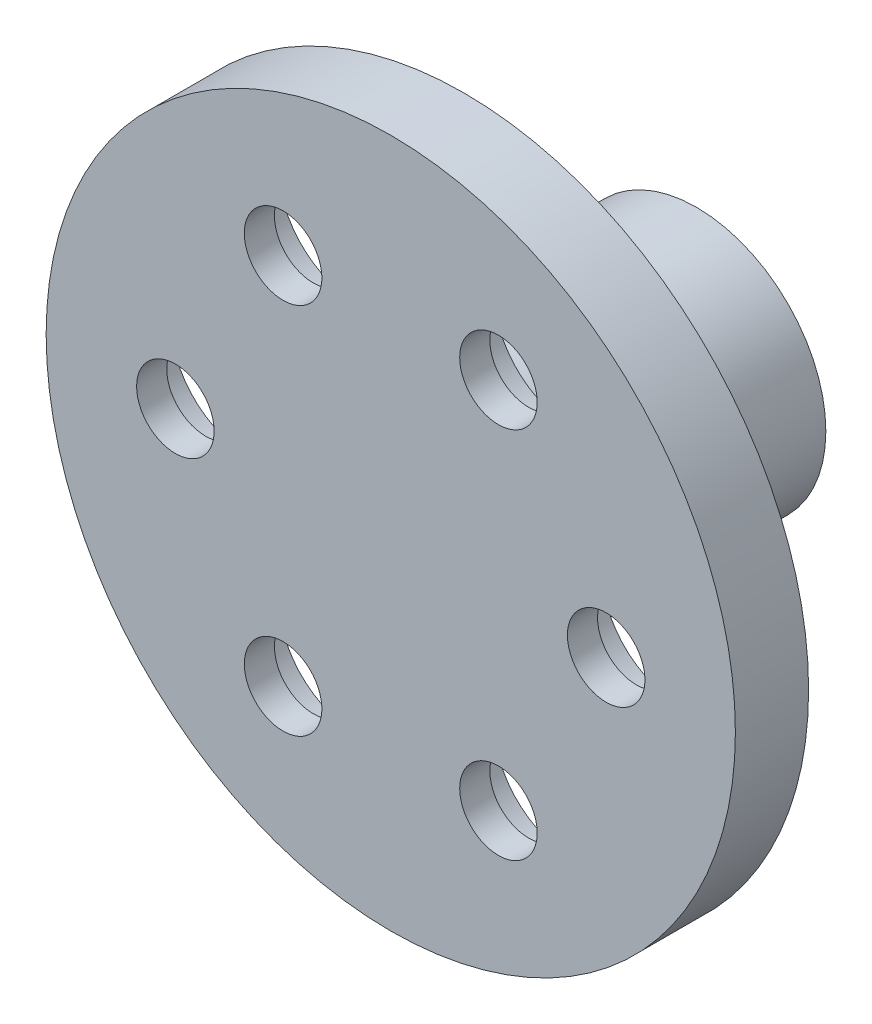
ISO-10303-21;
HEADER;
FILE_DESCRIPTION(('STEP AP214'),'2;1');
FILE_NAME('part.step','',(''),(''),'','','');
FILE_SCHEMA(('AUTOMOTIVE_DESIGN { 1 0 10303 214 1 1 1 1 }'));
ENDSEC;
DATA;
#1=APPLICATION_CONTEXT('core data for automotive mechanical design processes');
#2=APPLICATION_PROTOCOL_DEFINITION('international standard','automotive_design',2000,#1);
#3=PRODUCT_CONTEXT('',#1,'mechanical');
#4=PRODUCT('Part','Part','',(#3));
#5=PRODUCT_RELATED_PRODUCT_CATEGORY('part','',(#4));
#6=PRODUCT_DEFINITION_FORMATION('','',#4);
#7=PRODUCT_DEFINITION_CONTEXT('part definition',#1,'design');
#8=PRODUCT_DEFINITION('design','',#6,#7);
#9=PRODUCT_DEFINITION_SHAPE('','',#8);
#10=(LENGTH_UNIT() NAMED_UNIT(*) SI_UNIT(.MILLI.,.METRE.));
#11=(NAMED_UNIT(*) PLANE_ANGLE_UNIT() SI_UNIT($,.RADIAN.));
#12=(NAMED_UNIT(*) SI_UNIT($,.STERADIAN.) SOLID_ANGLE_UNIT());
#13=UNCERTAINTY_MEASURE_WITH_UNIT(LENGTH_MEASURE(1.E-05),#10,'distance_accuracy_value','');
#14=(GEOMETRIC_REPRESENTATION_CONTEXT(3) GLOBAL_UNCERTAINTY_ASSIGNED_CONTEXT((#13)) GLOBAL_UNIT_ASSIGNED_CONTEXT((#10,
#11,#12)) REPRESENTATION_CONTEXT('',''));
#15=CARTESIAN_POINT('',(0.,0.,0.));
#16=DIRECTION('',(0.,0.,1.));
#17=DIRECTION('',(1.,0.,0.));
#18=AXIS2_PLACEMENT_3D('',#15,#16,#17);
#19=CARTESIAN_POINT('',(0.,0.,0.));
#20=DIRECTION('',(0.,0.,1.));
#21=DIRECTION('',(1.,0.,0.));
#22=AXIS2_PLACEMENT_3D('',#19,#20,#21);
#23=PLANE('',#22);
#24=CARTESIAN_POINT('',(12.5,21.650635094611,0.));
#25=DIRECTION('',(0.,0.,-1.));
#26=DIRECTION('',(-1.,0.,0.));
#27=AXIS2_PLACEMENT_3D('',#24,#25,#26);
#28=CIRCLE('',#27,9.);
#29=CARTESIAN_POINT('',(3.49999999999999,21.650635094611,0.));
#30=VERTEX_POINT('',#29);
#31=EDGE_CURVE('E92',#30,#30,#28,.T.);
#32=ORIENTED_EDGE('',*,*,#31,.F.);
#33=EDGE_LOOP('',(#32));
#34=FACE_BOUND('',#33,.T.);
#35=CARTESIAN_POINT('',(-25.,0.,0.));
#36=DIRECTION('',(0.,0.,-1.));
#37=DIRECTION('',(-1.,0.,0.));
#38=AXIS2_PLACEMENT_3D('',#35,#36,#37);
#39=CIRCLE('',#38,9.);
#40=CARTESIAN_POINT('',(-34.,0.,0.));
#41=VERTEX_POINT('',#40);
#42=EDGE_CURVE('E104',#41,#41,#39,.T.);
#43=ORIENTED_EDGE('',*,*,#42,.F.);
#44=EDGE_LOOP('',(#43));
#45=FACE_BOUND('',#44,.T.);
#46=CARTESIAN_POINT('',(25.,0.,0.));
#47=DIRECTION('',(0.,0.,-1.));
#48=DIRECTION('',(-1.,0.,0.));
#49=AXIS2_PLACEMENT_3D('',#46,#47,#48);
#50=CIRCLE('',#49,9.);
#51=CARTESIAN_POINT('',(16.,0.,0.));
#52=VERTEX_POINT('',#51);
#53=EDGE_CURVE('E110',#52,#52,#50,.T.);
#54=ORIENTED_EDGE('',*,*,#53,.F.);
#55=EDGE_LOOP('',(#54));
#56=FACE_BOUND('',#55,.T.);
#57=CARTESIAN_POINT('',(12.5,-21.650635094611,0.));
#58=DIRECTION('',(0.,0.,-1.));
#59=DIRECTION('',(-1.,0.,0.));
#60=AXIS2_PLACEMENT_3D('',#57,#58,#59);
#61=CIRCLE('',#60,9.);
#62=CARTESIAN_POINT('',(3.50000000000001,-21.650635094611,0.));
#63=VERTEX_POINT('',#62);
#64=EDGE_CURVE('E116',#63,#63,#61,.T.);
#65=ORIENTED_EDGE('',*,*,#64,.F.);
#66=EDGE_LOOP('',(#65));
#67=FACE_BOUND('',#66,.T.);
#68=CARTESIAN_POINT('',(-12.5,-21.650635094611,0.));
#69=DIRECTION('',(0.,0.,-1.));
#70=DIRECTION('',(-1.,0.,0.));
#71=AXIS2_PLACEMENT_3D('',#68,#69,#70);
#72=CIRCLE('',#71,9.);
#73=CARTESIAN_POINT('',(-21.5,-21.650635094611,0.));
#74=VERTEX_POINT('',#73);
#75=EDGE_CURVE('E122',#74,#74,#72,.T.);
#76=ORIENTED_EDGE('',*,*,#75,.F.);
#77=EDGE_LOOP('',(#76));
#78=FACE_BOUND('',#77,.T.);
#79=CARTESIAN_POINT('',(0.,0.,0.));
#80=DIRECTION('',(0.,0.,-1.));
#81=DIRECTION('',(-1.,0.,0.));
#82=AXIS2_PLACEMENT_3D('',#79,#80,#81);
#83=CIRCLE('',#82,15.);
#84=CARTESIAN_POINT('',(-15.,0.,0.));
#85=VERTEX_POINT('',#84);
#86=EDGE_CURVE('E11',#85,#85,#83,.T.);
#87=ORIENTED_EDGE('',*,*,#86,.F.);
#88=EDGE_LOOP('',(#87));
#89=FACE_BOUND('',#88,.T.);
#90=CARTESIAN_POINT('',(0.,0.,0.));
#91=DIRECTION('',(0.,0.,1.));
#92=DIRECTION('',(1.,0.,0.));
#93=AXIS2_PLACEMENT_3D('',#90,#91,#92);
#94=CIRCLE('',#93,40.);
#95=CARTESIAN_POINT('',(40.,0.,0.));
#96=VERTEX_POINT('',#95);
#97=EDGE_CURVE('E127',#96,#96,#94,.T.);
#98=ORIENTED_EDGE('',*,*,#97,.F.);
#99=EDGE_LOOP('',(#98));
#100=FACE_BOUND('',#99,.T.);
#101=CARTESIAN_POINT('',(-12.5,21.650635094611,0.));
#102=DIRECTION('',(0.,0.,-1.));
#103=DIRECTION('',(-1.,0.,0.));
#104=AXIS2_PLACEMENT_3D('',#101,#102,#103);
#105=CIRCLE('',#104,9.);
#106=CARTESIAN_POINT('',(-21.5,21.650635094611,0.));
#107=VERTEX_POINT('',#106);
#108=EDGE_CURVE('E98',#107,#107,#105,.T.);
#109=ORIENTED_EDGE('',*,*,#108,.F.);
#110=EDGE_LOOP('',(#109));
#111=FACE_BOUND('',#110,.T.);
#112=ADVANCED_FACE('F34',(#34,#45,#56,#67,#78,#89,#100,#111),#23,.F.);
#113=CARTESIAN_POINT('',(0.,0.,8.5));
#114=DIRECTION('',(0.,0.,-1.));
#115=DIRECTION('',(-1.,0.,0.));
#116=AXIS2_PLACEMENT_3D('',#113,#114,#115);
#117=CYLINDRICAL_SURFACE('',#116,40.);
#118=CARTESIAN_POINT('',(0.,0.,8.5));
#119=DIRECTION('',(0.,0.,1.));
#120=DIRECTION('',(1.,0.,0.));
#121=AXIS2_PLACEMENT_3D('',#118,#119,#120);
#122=CIRCLE('',#121,40.);
#123=CARTESIAN_POINT('',(40.,0.,8.5));
#124=VERTEX_POINT('',#123);
#125=EDGE_CURVE('E42',#124,#124,#122,.T.);
#126=ORIENTED_EDGE('',*,*,#125,.F.);
#127=EDGE_LOOP('',(#126));
#128=FACE_BOUND('',#127,.T.);
#129=ORIENTED_EDGE('',*,*,#97,.T.);
#130=EDGE_LOOP('',(#129));
#131=FACE_BOUND('',#130,.T.);
#132=ADVANCED_FACE('F36',(#128,#131),#117,.T.);
#133=CARTESIAN_POINT('',(0.,0.,8.5));
#134=DIRECTION('',(0.,0.,1.));
#135=DIRECTION('',(1.,0.,0.));
#136=AXIS2_PLACEMENT_3D('',#133,#134,#135);
#137=PLANE('',#136);
#138=CARTESIAN_POINT('',(-12.5,21.650635094611,8.5));
#139=DIRECTION('',(0.,0.,-1.));
#140=DIRECTION('',(-1.,0.,0.));
#141=AXIS2_PLACEMENT_3D('',#138,#139,#140);
#142=CIRCLE('',#141,4.5);
#143=CARTESIAN_POINT('',(-17.,21.650635094611,8.5));
#144=VERTEX_POINT('',#143);
#145=EDGE_CURVE('E58',#144,#144,#142,.T.);
#146=ORIENTED_EDGE('',*,*,#145,.T.);
#147=EDGE_LOOP('',(#146));
#148=FACE_BOUND('',#147,.T.);
#149=CARTESIAN_POINT('',(-25.,0.,8.5));
#150=DIRECTION('',(0.,0.,-1.));
#151=DIRECTION('',(-1.,0.,0.));
#152=AXIS2_PLACEMENT_3D('',#149,#150,#151);
#153=CIRCLE('',#152,4.5);
#154=CARTESIAN_POINT('',(-29.5,0.,8.5));
#155=VERTEX_POINT('',#154);
#156=EDGE_CURVE('E66',#155,#155,#153,.T.);
#157=ORIENTED_EDGE('',*,*,#156,.T.);
#158=EDGE_LOOP('',(#157));
#159=FACE_BOUND('',#158,.T.);
#160=CARTESIAN_POINT('',(-12.5,-21.650635094611,8.5));
#161=DIRECTION('',(0.,0.,-1.));
#162=DIRECTION('',(-1.,0.,0.));
#163=AXIS2_PLACEMENT_3D('',#160,#161,#162);
#164=CIRCLE('',#163,4.5);
#165=CARTESIAN_POINT('',(-17.,-21.650635094611,8.5));
#166=VERTEX_POINT('',#165);
#167=EDGE_CURVE('E72',#166,#166,#164,.T.);
#168=ORIENTED_EDGE('',*,*,#167,.T.);
#169=EDGE_LOOP('',(#168));
#170=FACE_BOUND('',#169,.T.);
#171=CARTESIAN_POINT('',(12.5,-21.650635094611,8.5));
#172=DIRECTION('',(0.,0.,-1.));
#173=DIRECTION('',(-1.,0.,0.));
#174=AXIS2_PLACEMENT_3D('',#171,#172,#173);
#175=CIRCLE('',#174,4.5);
#176=CARTESIAN_POINT('',(8.00000000000001,-21.650635094611,8.5));
#177=VERTEX_POINT('',#176);
#178=EDGE_CURVE('E78',#177,#177,#175,.T.);
#179=ORIENTED_EDGE('',*,*,#178,.T.);
#180=EDGE_LOOP('',(#179));
#181=FACE_BOUND('',#180,.T.);
#182=CARTESIAN_POINT('',(25.,0.,8.5));
#183=DIRECTION('',(0.,0.,-1.));
#184=DIRECTION('',(-1.,0.,0.));
#185=AXIS2_PLACEMENT_3D('',#182,#183,#184);
#186=CIRCLE('',#185,4.5);
#187=CARTESIAN_POINT('',(20.5,0.,8.5));
#188=VERTEX_POINT('',#187);
#189=EDGE_CURVE('E81',#188,#188,#186,.T.);
#190=ORIENTED_EDGE('',*,*,#189,.T.);
#191=EDGE_LOOP('',(#190));
#192=FACE_BOUND('',#191,.T.);
#193=CARTESIAN_POINT('',(12.5,21.650635094611,8.5));
#194=DIRECTION('',(0.,0.,-1.));
#195=DIRECTION('',(-1.,0.,0.));
#196=AXIS2_PLACEMENT_3D('',#193,#194,#195);
#197=CIRCLE('',#196,4.5);
#198=CARTESIAN_POINT('',(7.99999999999999,21.650635094611,8.5));
#199=VERTEX_POINT('',#198);
#200=EDGE_CURVE('E85',#199,#199,#197,.T.);
#201=ORIENTED_EDGE('',*,*,#200,.T.);
#202=EDGE_LOOP('',(#201));
#203=FACE_BOUND('',#202,.T.);
#204=ORIENTED_EDGE('',*,*,#125,.T.);
#205=EDGE_LOOP('',(#204));
#206=FACE_BOUND('',#205,.T.);
#207=ADVANCED_FACE('F162',(#148,#159,#170,#181,#192,#203,#206),#137,.T.);
#208=CARTESIAN_POINT('',(0.,0.,-27.));
#209=DIRECTION('',(0.,0.,1.));
#210=DIRECTION('',(1.,0.,0.));
#211=AXIS2_PLACEMENT_3D('',#208,#209,#210);
#212=CYLINDRICAL_SURFACE('',#211,15.);
#213=CARTESIAN_POINT('',(0.,0.,-27.));
#214=DIRECTION('',(0.,0.,-1.));
#215=DIRECTION('',(-1.,0.,0.));
#216=AXIS2_PLACEMENT_3D('',#213,#214,#215);
#217=CIRCLE('',#216,15.);
#218=CARTESIAN_POINT('',(-15.,0.,-27.));
#219=VERTEX_POINT('',#218);
#220=EDGE_CURVE('E125',#219,#219,#217,.T.);
#221=ORIENTED_EDGE('',*,*,#220,.F.);
#222=EDGE_LOOP('',(#221));
#223=FACE_BOUND('',#222,.T.);
#224=ORIENTED_EDGE('',*,*,#86,.T.);
#225=EDGE_LOOP('',(#224));
#226=FACE_BOUND('',#225,.T.);
#227=ADVANCED_FACE('F169',(#223,#226),#212,.T.);
#228=CARTESIAN_POINT('',(0.,0.,-27.));
#229=DIRECTION('',(0.,0.,-1.));
#230=DIRECTION('',(-1.,0.,0.));
#231=AXIS2_PLACEMENT_3D('',#228,#229,#230);
#232=PLANE('',#231);
#233=CARTESIAN_POINT('',(0.,0.,-27.));
#234=DIRECTION('',(0.,0.,-1.));
#235=DIRECTION('',(-1.,0.,0.));
#236=AXIS2_PLACEMENT_3D('',#233,#234,#235);
#237=CIRCLE('',#236,3.8);
#238=CARTESIAN_POINT('',(-3.8,0.,-27.));
#239=VERTEX_POINT('',#238);
#240=EDGE_CURVE('E55',#239,#239,#237,.T.);
#241=ORIENTED_EDGE('',*,*,#240,.F.);
#242=EDGE_LOOP('',(#241));
#243=FACE_BOUND('',#242,.T.);
#244=ORIENTED_EDGE('',*,*,#220,.T.);
#245=EDGE_LOOP('',(#244));
#246=FACE_BOUND('',#245,.T.);
#247=ADVANCED_FACE('F173',(#243,#246),#232,.T.);
#248=CARTESIAN_POINT('',(-12.5,-21.650635094611,0.));
#249=DIRECTION('',(0.,0.,-1.));
#250=DIRECTION('',(-1.,0.,0.));
#251=AXIS2_PLACEMENT_3D('',#248,#249,#250);
#252=CYLINDRICAL_SURFACE('',#251,9.);
#253=CARTESIAN_POINT('',(-12.5,-21.650635094611,5.));
#254=DIRECTION('',(0.,0.,-1.));
#255=DIRECTION('',(-1.,0.,0.));
#256=AXIS2_PLACEMENT_3D('',#253,#254,#255);
#257=CIRCLE('',#256,9.);
#258=CARTESIAN_POINT('',(-21.5,-21.650635094611,5.));
#259=VERTEX_POINT('',#258);
#260=EDGE_CURVE('E119',#259,#259,#257,.T.);
#261=ORIENTED_EDGE('',*,*,#260,.F.);
#262=EDGE_LOOP('',(#261));
#263=FACE_BOUND('',#262,.T.);
#264=ORIENTED_EDGE('',*,*,#75,.T.);
#265=EDGE_LOOP('',(#264));
#266=FACE_BOUND('',#265,.T.);
#267=ADVANCED_FACE('F177',(#263,#266),#252,.F.);
#268=CARTESIAN_POINT('',(-3.49999999999998,-21.650635094611,5.));
#269=DIRECTION('',(0.,0.,1.));
#270=DIRECTION('',(1.,0.,0.));
#271=AXIS2_PLACEMENT_3D('',#268,#269,#270);
#272=PLANE('',#271);
#273=CARTESIAN_POINT('',(-12.5,-21.650635094611,5.));
#274=DIRECTION('',(0.,0.,1.));
#275=DIRECTION('',(1.,0.,0.));
#276=AXIS2_PLACEMENT_3D('',#273,#274,#275);
#277=CIRCLE('',#276,4.5);
#278=CARTESIAN_POINT('',(-7.99999999999998,-21.650635094611,5.));
#279=VERTEX_POINT('',#278);
#280=EDGE_CURVE('E75',#279,#279,#277,.T.);
#281=ORIENTED_EDGE('',*,*,#280,.T.);
#282=EDGE_LOOP('',(#281));
#283=FACE_BOUND('',#282,.T.);
#284=ORIENTED_EDGE('',*,*,#260,.T.);
#285=EDGE_LOOP('',(#284));
#286=FACE_BOUND('',#285,.T.);
#287=ADVANCED_FACE('F181',(#283,#286),#272,.F.);
#288=CARTESIAN_POINT('',(12.5,-21.650635094611,0.));
#289=DIRECTION('',(0.,0.,-1.));
#290=DIRECTION('',(-1.,0.,0.));
#291=AXIS2_PLACEMENT_3D('',#288,#289,#290);
#292=CYLINDRICAL_SURFACE('',#291,9.);
#293=CARTESIAN_POINT('',(12.5,-21.650635094611,5.));
#294=DIRECTION('',(0.,0.,-1.));
#295=DIRECTION('',(-1.,0.,0.));
#296=AXIS2_PLACEMENT_3D('',#293,#294,#295);
#297=CIRCLE('',#296,9.);
#298=CARTESIAN_POINT('',(3.50000000000001,-21.650635094611,5.));
#299=VERTEX_POINT('',#298);
#300=EDGE_CURVE('E113',#299,#299,#297,.T.);
#301=ORIENTED_EDGE('',*,*,#300,.F.);
#302=EDGE_LOOP('',(#301));
#303=FACE_BOUND('',#302,.T.);
#304=ORIENTED_EDGE('',*,*,#64,.T.);
#305=EDGE_LOOP('',(#304));
#306=FACE_BOUND('',#305,.T.);
#307=ADVANCED_FACE('F185',(#303,#306),#292,.F.);
#308=CARTESIAN_POINT('',(21.5,-21.650635094611,5.));
#309=DIRECTION('',(0.,0.,1.));
#310=DIRECTION('',(1.,0.,0.));
#311=AXIS2_PLACEMENT_3D('',#308,#309,#310);
#312=PLANE('',#311);
#313=CARTESIAN_POINT('',(12.5,-21.650635094611,5.));
#314=DIRECTION('',(0.,0.,1.));
#315=DIRECTION('',(1.,0.,0.));
#316=AXIS2_PLACEMENT_3D('',#313,#314,#315);
#317=CIRCLE('',#316,4.5);
#318=CARTESIAN_POINT('',(17.,-21.650635094611,5.));
#319=VERTEX_POINT('',#318);
#320=EDGE_CURVE('E38',#319,#319,#317,.T.);
#321=ORIENTED_EDGE('',*,*,#320,.T.);
#322=EDGE_LOOP('',(#321));
#323=FACE_BOUND('',#322,.T.);
#324=ORIENTED_EDGE('',*,*,#300,.T.);
#325=EDGE_LOOP('',(#324));
#326=FACE_BOUND('',#325,.T.);
#327=ADVANCED_FACE('F189',(#323,#326),#312,.F.);
#328=CARTESIAN_POINT('',(25.,0.,0.));
#329=DIRECTION('',(0.,0.,-1.));
#330=DIRECTION('',(-1.,0.,0.));
#331=AXIS2_PLACEMENT_3D('',#328,#329,#330);
#332=CYLINDRICAL_SURFACE('',#331,9.);
#333=CARTESIAN_POINT('',(25.,0.,5.));
#334=DIRECTION('',(0.,0.,-1.));
#335=DIRECTION('',(-1.,0.,0.));
#336=AXIS2_PLACEMENT_3D('',#333,#334,#335);
#337=CIRCLE('',#336,9.);
#338=CARTESIAN_POINT('',(16.,0.,5.));
#339=VERTEX_POINT('',#338);
#340=EDGE_CURVE('E107',#339,#339,#337,.T.);
#341=ORIENTED_EDGE('',*,*,#340,.F.);
#342=EDGE_LOOP('',(#341));
#343=FACE_BOUND('',#342,.T.);
#344=ORIENTED_EDGE('',*,*,#53,.T.);
#345=EDGE_LOOP('',(#344));
#346=FACE_BOUND('',#345,.T.);
#347=ADVANCED_FACE('F193',(#343,#346),#332,.F.);
#348=CARTESIAN_POINT('',(34.,0.,5.));
#349=DIRECTION('',(0.,0.,1.));
#350=DIRECTION('',(1.,0.,0.));
#351=AXIS2_PLACEMENT_3D('',#348,#349,#350);
#352=PLANE('',#351);
#353=CARTESIAN_POINT('',(25.,0.,5.));
#354=DIRECTION('',(0.,0.,1.));
#355=DIRECTION('',(1.,0.,0.));
#356=AXIS2_PLACEMENT_3D('',#353,#354,#355);
#357=CIRCLE('',#356,4.5);
#358=CARTESIAN_POINT('',(29.5,0.,5.));
#359=VERTEX_POINT('',#358);
#360=EDGE_CURVE('E84',#359,#359,#357,.T.);
#361=ORIENTED_EDGE('',*,*,#360,.T.);
#362=EDGE_LOOP('',(#361));
#363=FACE_BOUND('',#362,.T.);
#364=ORIENTED_EDGE('',*,*,#340,.T.);
#365=EDGE_LOOP('',(#364));
#366=FACE_BOUND('',#365,.T.);
#367=ADVANCED_FACE('F137',(#363,#366),#352,.F.);
#368=CARTESIAN_POINT('',(-25.,0.,0.));
#369=DIRECTION('',(0.,0.,-1.));
#370=DIRECTION('',(-1.,0.,0.));
#371=AXIS2_PLACEMENT_3D('',#368,#369,#370);
#372=CYLINDRICAL_SURFACE('',#371,9.);
#373=CARTESIAN_POINT('',(-25.,0.,5.));
#374=DIRECTION('',(0.,0.,-1.));
#375=DIRECTION('',(-1.,0.,0.));
#376=AXIS2_PLACEMENT_3D('',#373,#374,#375);
#377=CIRCLE('',#376,9.);
#378=CARTESIAN_POINT('',(-34.,0.,5.));
#379=VERTEX_POINT('',#378);
#380=EDGE_CURVE('E101',#379,#379,#377,.T.);
#381=ORIENTED_EDGE('',*,*,#380,.F.);
#382=EDGE_LOOP('',(#381));
#383=FACE_BOUND('',#382,.T.);
#384=ORIENTED_EDGE('',*,*,#42,.T.);
#385=EDGE_LOOP('',(#384));
#386=FACE_BOUND('',#385,.T.);
#387=ADVANCED_FACE('F200',(#383,#386),#372,.F.);
#388=CARTESIAN_POINT('',(-16.,0.,5.));
#389=DIRECTION('',(0.,0.,1.));
#390=DIRECTION('',(1.,0.,0.));
#391=AXIS2_PLACEMENT_3D('',#388,#389,#390);
#392=PLANE('',#391);
#393=CARTESIAN_POINT('',(-25.,0.,5.));
#394=DIRECTION('',(0.,0.,1.));
#395=DIRECTION('',(1.,0.,0.));
#396=AXIS2_PLACEMENT_3D('',#393,#394,#395);
#397=CIRCLE('',#396,4.5);
#398=CARTESIAN_POINT('',(-20.5,0.,5.));
#399=VERTEX_POINT('',#398);
#400=EDGE_CURVE('E69',#399,#399,#397,.T.);
#401=ORIENTED_EDGE('',*,*,#400,.T.);
#402=EDGE_LOOP('',(#401));
#403=FACE_BOUND('',#402,.T.);
#404=ORIENTED_EDGE('',*,*,#380,.T.);
#405=EDGE_LOOP('',(#404));
#406=FACE_BOUND('',#405,.T.);
#407=ADVANCED_FACE('F203',(#403,#406),#392,.F.);
#408=CARTESIAN_POINT('',(-12.5,21.650635094611,0.));
#409=DIRECTION('',(0.,0.,-1.));
#410=DIRECTION('',(-1.,0.,0.));
#411=AXIS2_PLACEMENT_3D('',#408,#409,#410);
#412=CYLINDRICAL_SURFACE('',#411,9.);
#413=CARTESIAN_POINT('',(-12.5,21.650635094611,5.));
#414=DIRECTION('',(0.,0.,-1.));
#415=DIRECTION('',(-1.,0.,0.));
#416=AXIS2_PLACEMENT_3D('',#413,#414,#415);
#417=CIRCLE('',#416,9.);
#418=CARTESIAN_POINT('',(-21.5,21.650635094611,5.));
#419=VERTEX_POINT('',#418);
#420=EDGE_CURVE('E95',#419,#419,#417,.T.);
#421=ORIENTED_EDGE('',*,*,#420,.F.);
#422=EDGE_LOOP('',(#421));
#423=FACE_BOUND('',#422,.T.);
#424=ORIENTED_EDGE('',*,*,#108,.T.);
#425=EDGE_LOOP('',(#424));
#426=FACE_BOUND('',#425,.T.);
#427=ADVANCED_FACE('F207',(#423,#426),#412,.F.);
#428=CARTESIAN_POINT('',(-3.50000000000001,21.650635094611,5.));
#429=DIRECTION('',(0.,0.,1.));
#430=DIRECTION('',(1.,0.,0.));
#431=AXIS2_PLACEMENT_3D('',#428,#429,#430);
#432=PLANE('',#431);
#433=CARTESIAN_POINT('',(-12.5,21.650635094611,5.));
#434=DIRECTION('',(0.,0.,1.));
#435=DIRECTION('',(1.,0.,0.));
#436=AXIS2_PLACEMENT_3D('',#433,#434,#435);
#437=CIRCLE('',#436,4.5);
#438=CARTESIAN_POINT('',(-8.00000000000001,21.650635094611,5.));
#439=VERTEX_POINT('',#438);
#440=EDGE_CURVE('E63',#439,#439,#437,.T.);
#441=ORIENTED_EDGE('',*,*,#440,.T.);
#442=EDGE_LOOP('',(#441));
#443=FACE_BOUND('',#442,.T.);
#444=ORIENTED_EDGE('',*,*,#420,.T.);
#445=EDGE_LOOP('',(#444));
#446=FACE_BOUND('',#445,.T.);
#447=ADVANCED_FACE('F211',(#443,#446),#432,.F.);
#448=CARTESIAN_POINT('',(12.5,21.650635094611,0.));
#449=DIRECTION('',(0.,0.,-1.));
#450=DIRECTION('',(-1.,0.,0.));
#451=AXIS2_PLACEMENT_3D('',#448,#449,#450);
#452=CYLINDRICAL_SURFACE('',#451,9.);
#453=CARTESIAN_POINT('',(12.5,21.650635094611,5.));
#454=DIRECTION('',(0.,0.,-1.));
#455=DIRECTION('',(-1.,0.,0.));
#456=AXIS2_PLACEMENT_3D('',#453,#454,#455);
#457=CIRCLE('',#456,9.);
#458=CARTESIAN_POINT('',(3.49999999999999,21.650635094611,5.));
#459=VERTEX_POINT('',#458);
#460=EDGE_CURVE('E89',#459,#459,#457,.T.);
#461=ORIENTED_EDGE('',*,*,#460,.F.);
#462=EDGE_LOOP('',(#461));
#463=FACE_BOUND('',#462,.T.);
#464=ORIENTED_EDGE('',*,*,#31,.T.);
#465=EDGE_LOOP('',(#464));
#466=FACE_BOUND('',#465,.T.);
#467=ADVANCED_FACE('F215',(#463,#466),#452,.F.);
#468=CARTESIAN_POINT('',(21.5,21.650635094611,5.));
#469=DIRECTION('',(0.,0.,1.));
#470=DIRECTION('',(1.,0.,0.));
#471=AXIS2_PLACEMENT_3D('',#468,#469,#470);
#472=PLANE('',#471);
#473=CARTESIAN_POINT('',(12.5,21.650635094611,5.));
#474=DIRECTION('',(0.,0.,1.));
#475=DIRECTION('',(1.,0.,0.));
#476=AXIS2_PLACEMENT_3D('',#473,#474,#475);
#477=CIRCLE('',#476,4.5);
#478=CARTESIAN_POINT('',(17.,21.650635094611,5.));
#479=VERTEX_POINT('',#478);
#480=EDGE_CURVE('E88',#479,#479,#477,.T.);
#481=ORIENTED_EDGE('',*,*,#480,.T.);
#482=EDGE_LOOP('',(#481));
#483=FACE_BOUND('',#482,.T.);
#484=ORIENTED_EDGE('',*,*,#460,.T.);
#485=EDGE_LOOP('',(#484));
#486=FACE_BOUND('',#485,.T.);
#487=ADVANCED_FACE('F153',(#483,#486),#472,.F.);
#488=CARTESIAN_POINT('',(12.5,21.650635094611,0.));
#489=DIRECTION('',(0.,0.,-1.));
#490=DIRECTION('',(-1.,0.,0.));
#491=AXIS2_PLACEMENT_3D('',#488,#489,#490);
#492=CYLINDRICAL_SURFACE('',#491,4.5);
#493=ORIENTED_EDGE('',*,*,#200,.F.);
#494=EDGE_LOOP('',(#493));
#495=FACE_BOUND('',#494,.T.);
#496=ORIENTED_EDGE('',*,*,#480,.F.);
#497=EDGE_LOOP('',(#496));
#498=FACE_BOUND('',#497,.T.);
#499=ADVANCED_FACE('F143',(#495,#498),#492,.F.);
#500=CARTESIAN_POINT('',(25.,0.,0.));
#501=DIRECTION('',(0.,0.,-1.));
#502=DIRECTION('',(-1.,0.,0.));
#503=AXIS2_PLACEMENT_3D('',#500,#501,#502);
#504=CYLINDRICAL_SURFACE('',#503,4.5);
#505=ORIENTED_EDGE('',*,*,#189,.F.);
#506=EDGE_LOOP('',(#505));
#507=FACE_BOUND('',#506,.T.);
#508=ORIENTED_EDGE('',*,*,#360,.F.);
#509=EDGE_LOOP('',(#508));
#510=FACE_BOUND('',#509,.T.);
#511=ADVANCED_FACE('F140',(#507,#510),#504,.F.);
#512=CARTESIAN_POINT('',(12.5,-21.650635094611,0.));
#513=DIRECTION('',(0.,0.,-1.));
#514=DIRECTION('',(-1.,0.,0.));
#515=AXIS2_PLACEMENT_3D('',#512,#513,#514);
#516=CYLINDRICAL_SURFACE('',#515,4.5);
#517=ORIENTED_EDGE('',*,*,#178,.F.);
#518=EDGE_LOOP('',(#517));
#519=FACE_BOUND('',#518,.T.);
#520=ORIENTED_EDGE('',*,*,#320,.F.);
#521=EDGE_LOOP('',(#520));
#522=FACE_BOUND('',#521,.T.);
#523=ADVANCED_FACE('F142',(#519,#522),#516,.F.);
#524=CARTESIAN_POINT('',(-12.5,-21.650635094611,0.));
#525=DIRECTION('',(0.,0.,-1.));
#526=DIRECTION('',(-1.,0.,0.));
#527=AXIS2_PLACEMENT_3D('',#524,#525,#526);
#528=CYLINDRICAL_SURFACE('',#527,4.5);
#529=ORIENTED_EDGE('',*,*,#167,.F.);
#530=EDGE_LOOP('',(#529));
#531=FACE_BOUND('',#530,.T.);
#532=ORIENTED_EDGE('',*,*,#280,.F.);
#533=EDGE_LOOP('',(#532));
#534=FACE_BOUND('',#533,.T.);
#535=ADVANCED_FACE('F150',(#531,#534),#528,.F.);
#536=CARTESIAN_POINT('',(-25.,0.,0.));
#537=DIRECTION('',(0.,0.,-1.));
#538=DIRECTION('',(-1.,0.,0.));
#539=AXIS2_PLACEMENT_3D('',#536,#537,#538);
#540=CYLINDRICAL_SURFACE('',#539,4.5);
#541=ORIENTED_EDGE('',*,*,#156,.F.);
#542=EDGE_LOOP('',(#541));
#543=FACE_BOUND('',#542,.T.);
#544=ORIENTED_EDGE('',*,*,#400,.F.);
#545=EDGE_LOOP('',(#544));
#546=FACE_BOUND('',#545,.T.);
#547=ADVANCED_FACE('F255',(#543,#546),#540,.F.);
#548=CARTESIAN_POINT('',(-12.5,21.650635094611,0.));
#549=DIRECTION('',(0.,0.,-1.));
#550=DIRECTION('',(-1.,0.,0.));
#551=AXIS2_PLACEMENT_3D('',#548,#549,#550);
#552=CYLINDRICAL_SURFACE('',#551,4.5);
#553=ORIENTED_EDGE('',*,*,#145,.F.);
#554=EDGE_LOOP('',(#553));
#555=FACE_BOUND('',#554,.T.);
#556=ORIENTED_EDGE('',*,*,#440,.F.);
#557=EDGE_LOOP('',(#556));
#558=FACE_BOUND('',#557,.T.);
#559=ADVANCED_FACE('F265',(#555,#558),#552,.F.);
#560=CARTESIAN_POINT('',(0.,0.,-27.));
#561=DIRECTION('',(0.,0.,-1.));
#562=DIRECTION('',(-1.,0.,0.));
#563=AXIS2_PLACEMENT_3D('',#560,#561,#562);
#564=CYLINDRICAL_SURFACE('',#563,3.8);
#565=CARTESIAN_POINT('',(0.,0.,-17.));
#566=DIRECTION('',(0.,0.,-1.));
#567=DIRECTION('',(-1.,0.,0.));
#568=AXIS2_PLACEMENT_3D('',#565,#566,#567);
#569=CIRCLE('',#568,3.8);
#570=CARTESIAN_POINT('',(-3.8,0.,-17.));
#571=VERTEX_POINT('',#570);
#572=EDGE_CURVE('E53',#571,#571,#569,.T.);
#573=ORIENTED_EDGE('',*,*,#572,.F.);
#574=EDGE_LOOP('',(#573));
#575=FACE_BOUND('',#574,.T.);
#576=ORIENTED_EDGE('',*,*,#240,.T.);
#577=EDGE_LOOP('',(#576));
#578=FACE_BOUND('',#577,.T.);
#579=ADVANCED_FACE('F49',(#575,#578),#564,.F.);
#580=CARTESIAN_POINT('',(0.,0.,-17.));
#581=DIRECTION('',(0.,0.,-1.));
#582=DIRECTION('',(-1.,0.,0.));
#583=AXIS2_PLACEMENT_3D('',#580,#581,#582);
#584=CONICAL_SURFACE('',#583,3.8,1.02974425867666);
#585=CARTESIAN_POINT('',(0.,0.,-14.7167296476953));
#586=VERTEX_POINT('',#585);
#587=VERTEX_LOOP('',#586);
#588=FACE_BOUND('',#587,.T.);
#589=ORIENTED_EDGE('',*,*,#572,.T.);
#590=EDGE_LOOP('',(#589));
#591=FACE_BOUND('',#590,.T.);
#592=ADVANCED_FACE('F46',(#588,#591),#584,.F.);
#593=CLOSED_SHELL('',(#112,#132,#207,#227,#247,#267,#287,#307,#327,#347,#367,#387,#407,#427,
#447,#467,#487,#499,#511,#523,#535,#547,#559,#579,#592));
#594=MANIFOLD_SOLID_BREP('B2',#593);
#595=ADVANCED_BREP_SHAPE_REPRESENTATION('',(#18,#594),#14);
#596=SHAPE_DEFINITION_REPRESENTATION(#9,#595);
ENDSEC;
END-ISO-10303-21;
